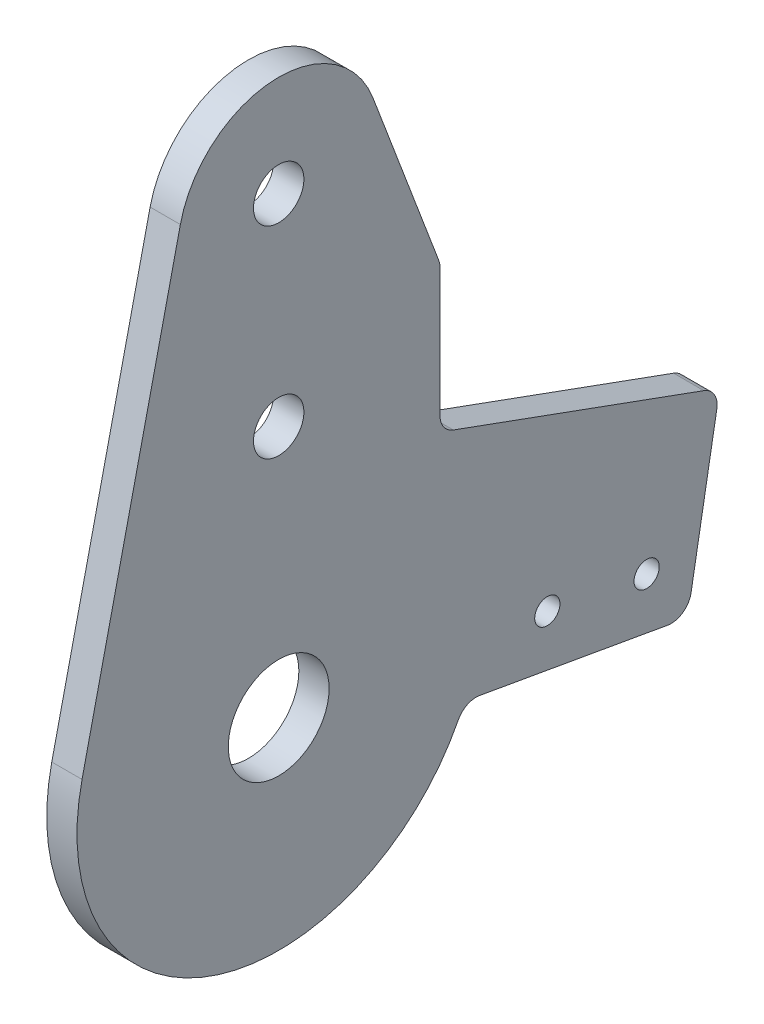
ISO-10303-21;
HEADER;
FILE_DESCRIPTION(('STEP AP214'),'2;1');
FILE_NAME('part.step','',(''),(''),'','','');
FILE_SCHEMA(('AUTOMOTIVE_DESIGN { 1 0 10303 214 1 1 1 1 }'));
ENDSEC;
DATA;
#1=APPLICATION_CONTEXT('core data for automotive mechanical design processes');
#2=APPLICATION_PROTOCOL_DEFINITION('international standard','automotive_design',2000,#1);
#3=PRODUCT_CONTEXT('',#1,'mechanical');
#4=PRODUCT('Part','Part','',(#3));
#5=PRODUCT_RELATED_PRODUCT_CATEGORY('part','',(#4));
#6=PRODUCT_DEFINITION_FORMATION('','',#4);
#7=PRODUCT_DEFINITION_CONTEXT('part definition',#1,'design');
#8=PRODUCT_DEFINITION('design','',#6,#7);
#9=PRODUCT_DEFINITION_SHAPE('','',#8);
#10=(LENGTH_UNIT() NAMED_UNIT(*) SI_UNIT(.MILLI.,.METRE.));
#11=(NAMED_UNIT(*) PLANE_ANGLE_UNIT() SI_UNIT($,.RADIAN.));
#12=(NAMED_UNIT(*) SI_UNIT($,.STERADIAN.) SOLID_ANGLE_UNIT());
#13=UNCERTAINTY_MEASURE_WITH_UNIT(LENGTH_MEASURE(1.E-05),#10,'distance_accuracy_value','');
#14=(GEOMETRIC_REPRESENTATION_CONTEXT(3) GLOBAL_UNCERTAINTY_ASSIGNED_CONTEXT((#13)) GLOBAL_UNIT_ASSIGNED_CONTEXT((#10,
#11,#12)) REPRESENTATION_CONTEXT('',''));
#15=CARTESIAN_POINT('',(0.,0.,0.));
#16=DIRECTION('',(0.,0.,1.));
#17=DIRECTION('',(1.,0.,0.));
#18=AXIS2_PLACEMENT_3D('',#15,#16,#17);
#19=CARTESIAN_POINT('',(3.,15.,50.));
#20=DIRECTION('',(1.,0.,0.));
#21=DIRECTION('',(0.,0.,-1.));
#22=AXIS2_PLACEMENT_3D('',#19,#20,#21);
#23=PLANE('',#22);
#24=CARTESIAN_POINT('',(3.,-34.1684893345555,23.3612051660587));
#25=DIRECTION('',(1.,0.,0.));
#26=DIRECTION('',(0.,0.,-1.));
#27=AXIS2_PLACEMENT_3D('',#24,#25,#26);
#28=CIRCLE('',#27,1.25);
#29=CARTESIAN_POINT('',(3.,-34.1684893345555,22.1112051660587));
#30=VERTEX_POINT('',#29);
#31=EDGE_CURVE('E543',#30,#30,#28,.T.);
#32=ORIENTED_EDGE('',*,*,#31,.F.);
#33=EDGE_LOOP('',(#32));
#34=FACE_BOUND('',#33,.T.);
#35=CARTESIAN_POINT('',(3.,-30.,50.));
#36=DIRECTION('',(1.,0.,0.));
#37=DIRECTION('',(0.,0.,-1.));
#38=AXIS2_PLACEMENT_3D('',#35,#36,#37);
#39=CIRCLE('',#38,5.);
#40=CARTESIAN_POINT('',(3.,-30.,45.));
#41=VERTEX_POINT('',#40);
#42=EDGE_CURVE('E568',#41,#41,#39,.T.);
#43=ORIENTED_EDGE('',*,*,#42,.F.);
#44=EDGE_LOOP('',(#43));
#45=FACE_BOUND('',#44,.T.);
#46=DIRECTION('',(0.,0.984807753012208,-0.173648177666931));
#47=VECTOR('',#46,1.);
#48=CARTESIAN_POINT('',(3.,-41.6972507646205,9.45732975921019));
#49=LINE('',#48,#47);
#50=CARTESIAN_POINT('',(3.,-39.7276352585961,9.11003340387632));
#51=VERTEX_POINT('',#50);
#52=CARTESIAN_POINT('',(3.,-25.2245440688507,6.55274712344899));
#53=VERTEX_POINT('',#52);
#54=EDGE_CURVE('E262',#51,#53,#49,.T.);
#55=ORIENTED_EDGE('',*,*,#54,.T.);
#56=CARTESIAN_POINT('',(3.,-24.8772477135169,8.52236262947341));
#57=DIRECTION('',(1.,0.,0.));
#58=DIRECTION('',(0.,0.,-1.));
#59=AXIS2_PLACEMENT_3D('',#56,#57,#58);
#60=CIRCLE('',#59,2.);
#61=CARTESIAN_POINT('',(3.,-22.9978624719451,7.83832234282207));
#62=VERTEX_POINT('',#61);
#63=EDGE_CURVE('E214',#53,#62,#60,.T.);
#64=ORIENTED_EDGE('',*,*,#63,.T.);
#65=DIRECTION('',(0.,0.34202014332567,0.939692620785908));
#66=VECTOR('',#65,1.);
#67=CARTESIAN_POINT('',(3.,-13.4757905262651,34.));
#68=LINE('',#67,#66);
#69=CARTESIAN_POINT('',(3.,-13.9547606914175,32.6840402866513));
#70=VERTEX_POINT('',#69);
#71=EDGE_CURVE('E255',#62,#70,#68,.T.);
#72=ORIENTED_EDGE('',*,*,#71,.T.);
#73=CARTESIAN_POINT('',(3.,-12.0753754498457,32.));
#74=DIRECTION('',(1.,0.,0.));
#75=DIRECTION('',(0.,0.,-1.));
#76=AXIS2_PLACEMENT_3D('',#73,#74,#75);
#77=CIRCLE('',#76,2.);
#78=CARTESIAN_POINT('',(3.,-12.0753754498457,34.));
#79=VERTEX_POINT('',#78);
#80=EDGE_CURVE('E11',#70,#79,#77,.F.);
#81=ORIENTED_EDGE('',*,*,#80,.T.);
#82=DIRECTION('',(0.,1.,0.));
#83=VECTOR('',#82,1.);
#84=CARTESIAN_POINT('',(3.,-13.4757905262651,34.));
#85=LINE('',#84,#83);
#86=CARTESIAN_POINT('',(3.,0.633718227746634,34.));
#87=VERTEX_POINT('',#86);
#88=EDGE_CURVE('E254',#79,#87,#85,.T.);
#89=ORIENTED_EDGE('',*,*,#88,.T.);
#90=CARTESIAN_POINT('',(3.,0.633718227746634,36.));
#91=DIRECTION('',(1.,0.,0.));
#92=DIRECTION('',(0.,0.,-1.));
#93=AXIS2_PLACEMENT_3D('',#90,#91,#92);
#94=CIRCLE('',#93,2.);
#95=CARTESIAN_POINT('',(3.,1.34250853141345,34.1298084842915));
#96=VERTEX_POINT('',#95);
#97=EDGE_CURVE('E61',#87,#96,#94,.T.);
#98=ORIENTED_EDGE('',*,*,#97,.T.);
#99=DIRECTION('',(0.,0.93509575785423,0.354395151833406));
#100=VECTOR('',#99,1.);
#101=CARTESIAN_POINT('',(3.,0.999999999999997,34.));
#102=LINE('',#101,#100);
#103=CARTESIAN_POINT('',(3.,18.5439515183341,40.6490424214577));
#104=VERTEX_POINT('',#103);
#105=EDGE_CURVE('E159',#96,#104,#102,.T.);
#106=ORIENTED_EDGE('',*,*,#105,.T.);
#107=CARTESIAN_POINT('',(3.,15.,50.));
#108=DIRECTION('',(1.,0.,0.));
#109=DIRECTION('',(0.,0.,-1.));
#110=AXIS2_PLACEMENT_3D('',#107,#108,#109);
#111=CIRCLE('',#110,10.);
#112=CARTESIAN_POINT('',(3.,17.2222222222222,59.7499604304357));
#113=VERTEX_POINT('',#112);
#114=EDGE_CURVE('E154',#104,#113,#111,.T.);
#115=ORIENTED_EDGE('',*,*,#114,.T.);
#116=DIRECTION('',(0.,-0.974996043043569,0.222222222222222));
#117=VECTOR('',#116,1.);
#118=CARTESIAN_POINT('',(3.,17.2222222222222,59.7499604304357));
#119=LINE('',#118,#117);
#120=CARTESIAN_POINT('',(3.,-25.5555555555556,69.4999208608714));
#121=VERTEX_POINT('',#120);
#122=EDGE_CURVE('E142',#113,#121,#119,.T.);
#123=ORIENTED_EDGE('',*,*,#122,.T.);
#124=CARTESIAN_POINT('',(3.,-30.,50.));
#125=DIRECTION('',(1.,0.,0.));
#126=DIRECTION('',(0.,0.,-1.));
#127=AXIS2_PLACEMENT_3D('',#124,#125,#126);
#128=CIRCLE('',#127,20.);
#129=CARTESIAN_POINT('',(3.,-39.1197842054181,32.200293933702));
#130=VERTEX_POINT('',#129);
#131=EDGE_CURVE('E153',#121,#130,#128,.T.);
#132=ORIENTED_EDGE('',*,*,#131,.T.);
#133=CARTESIAN_POINT('',(3.,-40.0317626259599,30.4203233270722));
#134=DIRECTION('',(1.,0.,0.));
#135=DIRECTION('',(0.,0.,-1.));
#136=AXIS2_PLACEMENT_3D('',#133,#134,#135);
#137=CIRCLE('',#136,2.);
#138=CARTESIAN_POINT('',(3.,-38.0621471199355,30.0730269717383));
#139=VERTEX_POINT('',#138);
#140=EDGE_CURVE('E230',#130,#139,#137,.F.);
#141=ORIENTED_EDGE('',*,*,#140,.T.);
#142=DIRECTION('',(0.,-0.17364817766693,-0.984807753012208));
#143=VECTOR('',#142,1.);
#144=CARTESIAN_POINT('',(3.,-41.6972507646205,9.45732975921019));
#145=LINE('',#144,#143);
#146=CARTESIAN_POINT('',(3.,-41.3499544092866,11.4269452652346));
#147=VERTEX_POINT('',#146);
#148=EDGE_CURVE('E295',#139,#147,#145,.T.);
#149=ORIENTED_EDGE('',*,*,#148,.T.);
#150=CARTESIAN_POINT('',(3.,-39.3803389032622,11.0796489099007));
#151=DIRECTION('',(1.,0.,0.));
#152=DIRECTION('',(0.,0.,-1.));
#153=AXIS2_PLACEMENT_3D('',#150,#151,#152);
#154=CIRCLE('',#153,2.);
#155=EDGE_CURVE('E209',#147,#51,#154,.T.);
#156=ORIENTED_EDGE('',*,*,#155,.T.);
#157=EDGE_LOOP('',(#55,#64,#72,#81,#89,#98,#106,#115,#123,#132,#141,#149,#156));
#158=FACE_BOUND('',#157,.T.);
#159=CARTESIAN_POINT('',(3.,-5.,50.));
#160=DIRECTION('',(1.,0.,0.));
#161=DIRECTION('',(0.,0.,-1.));
#162=AXIS2_PLACEMENT_3D('',#159,#160,#161);
#163=CIRCLE('',#162,2.5);
#164=CARTESIAN_POINT('',(3.,-5.,47.5));
#165=VERTEX_POINT('',#164);
#166=EDGE_CURVE('E269',#165,#165,#163,.T.);
#167=ORIENTED_EDGE('',*,*,#166,.F.);
#168=EDGE_LOOP('',(#167));
#169=FACE_BOUND('',#168,.T.);
#170=CARTESIAN_POINT('',(3.,15.,50.));
#171=DIRECTION('',(1.,0.,0.));
#172=DIRECTION('',(0.,0.,-1.));
#173=AXIS2_PLACEMENT_3D('',#170,#171,#172);
#174=CIRCLE('',#173,2.5);
#175=CARTESIAN_POINT('',(3.,15.,47.5));
#176=VERTEX_POINT('',#175);
#177=EDGE_CURVE('E560',#176,#176,#174,.T.);
#178=ORIENTED_EDGE('',*,*,#177,.F.);
#179=EDGE_LOOP('',(#178));
#180=FACE_BOUND('',#179,.T.);
#181=CARTESIAN_POINT('',(3.,-35.9049711112248,13.5131276359366));
#182=DIRECTION('',(1.,0.,0.));
#183=DIRECTION('',(0.,0.,-1.));
#184=AXIS2_PLACEMENT_3D('',#181,#182,#183);
#185=CIRCLE('',#184,1.25);
#186=CARTESIAN_POINT('',(3.,-35.9049711112248,12.2631276359366));
#187=VERTEX_POINT('',#186);
#188=EDGE_CURVE('E549',#187,#187,#185,.T.);
#189=ORIENTED_EDGE('',*,*,#188,.F.);
#190=EDGE_LOOP('',(#189));
#191=FACE_BOUND('',#190,.T.);
#192=ADVANCED_FACE('F45',(#34,#45,#158,#169,#180,#191),#23,.T.);
#193=CARTESIAN_POINT('',(0.,15.,50.));
#194=DIRECTION('',(1.,0.,0.));
#195=DIRECTION('',(0.,0.,-1.));
#196=AXIS2_PLACEMENT_3D('',#193,#194,#195);
#197=PLANE('',#196);
#198=DIRECTION('',(0.,0.34202014332567,0.939692620785908));
#199=VECTOR('',#198,1.);
#200=CARTESIAN_POINT('',(0.,-13.4757905262651,34.));
#201=LINE('',#200,#199);
#202=CARTESIAN_POINT('',(0.,-22.9978624719451,7.83832234282207));
#203=VERTEX_POINT('',#202);
#204=CARTESIAN_POINT('',(0.,-13.9547606914175,32.6840402866513));
#205=VERTEX_POINT('',#204);
#206=EDGE_CURVE('E239',#203,#205,#201,.T.);
#207=ORIENTED_EDGE('',*,*,#206,.F.);
#208=CARTESIAN_POINT('',(0.,-24.8772477135169,8.52236262947341));
#209=DIRECTION('',(1.,0.,0.));
#210=DIRECTION('',(0.,0.,-1.));
#211=AXIS2_PLACEMENT_3D('',#208,#209,#210);
#212=CIRCLE('',#211,2.);
#213=CARTESIAN_POINT('',(0.,-25.2245440688507,6.55274712344899));
#214=VERTEX_POINT('',#213);
#215=EDGE_CURVE('E199',#203,#214,#212,.F.);
#216=ORIENTED_EDGE('',*,*,#215,.T.);
#217=DIRECTION('',(0.,0.984807753012208,-0.173648177666931));
#218=VECTOR('',#217,1.);
#219=CARTESIAN_POINT('',(0.,-41.6972507646205,9.45732975921019));
#220=LINE('',#219,#218);
#221=CARTESIAN_POINT('',(0.,-39.7276352585961,9.11003340387632));
#222=VERTEX_POINT('',#221);
#223=EDGE_CURVE('E250',#222,#214,#220,.T.);
#224=ORIENTED_EDGE('',*,*,#223,.F.);
#225=CARTESIAN_POINT('',(0.,-39.3803389032622,11.0796489099007));
#226=DIRECTION('',(1.,0.,0.));
#227=DIRECTION('',(0.,0.,-1.));
#228=AXIS2_PLACEMENT_3D('',#225,#226,#227);
#229=CIRCLE('',#228,2.);
#230=CARTESIAN_POINT('',(0.,-41.3499544092866,11.4269452652346));
#231=VERTEX_POINT('',#230);
#232=EDGE_CURVE('E193',#222,#231,#229,.F.);
#233=ORIENTED_EDGE('',*,*,#232,.T.);
#234=DIRECTION('',(0.,-0.17364817766693,-0.984807753012208));
#235=VECTOR('',#234,1.);
#236=CARTESIAN_POINT('',(0.,-41.6972507646205,9.45732975921019));
#237=LINE('',#236,#235);
#238=CARTESIAN_POINT('',(0.,-38.0621471199355,30.0730269717383));
#239=VERTEX_POINT('',#238);
#240=EDGE_CURVE('E276',#239,#231,#237,.T.);
#241=ORIENTED_EDGE('',*,*,#240,.F.);
#242=CARTESIAN_POINT('',(0.,-40.0317626259599,30.4203233270722));
#243=DIRECTION('',(1.,0.,0.));
#244=DIRECTION('',(0.,0.,-1.));
#245=AXIS2_PLACEMENT_3D('',#242,#243,#244);
#246=CIRCLE('',#245,2.);
#247=CARTESIAN_POINT('',(0.,-39.1197842054181,32.200293933702));
#248=VERTEX_POINT('',#247);
#249=EDGE_CURVE('E227',#239,#248,#246,.T.);
#250=ORIENTED_EDGE('',*,*,#249,.T.);
#251=CARTESIAN_POINT('',(0.,-30.,50.));
#252=DIRECTION('',(1.,0.,0.));
#253=DIRECTION('',(0.,0.,-1.));
#254=AXIS2_PLACEMENT_3D('',#251,#252,#253);
#255=CIRCLE('',#254,20.);
#256=CARTESIAN_POINT('',(0.,-25.5555555555556,69.4999208608714));
#257=VERTEX_POINT('',#256);
#258=EDGE_CURVE('E272',#257,#248,#255,.T.);
#259=ORIENTED_EDGE('',*,*,#258,.F.);
#260=DIRECTION('',(0.,-0.974996043043569,0.222222222222222));
#261=VECTOR('',#260,1.);
#262=CARTESIAN_POINT('',(0.,17.2222222222222,59.7499604304357));
#263=LINE('',#262,#261);
#264=CARTESIAN_POINT('',(0.,17.2222222222222,59.7499604304357));
#265=VERTEX_POINT('',#264);
#266=EDGE_CURVE('E268',#265,#257,#263,.T.);
#267=ORIENTED_EDGE('',*,*,#266,.F.);
#268=CARTESIAN_POINT('',(0.,15.,50.));
#269=DIRECTION('',(1.,0.,0.));
#270=DIRECTION('',(0.,0.,-1.));
#271=AXIS2_PLACEMENT_3D('',#268,#269,#270);
#272=CIRCLE('',#271,10.);
#273=CARTESIAN_POINT('',(0.,18.5439515183341,40.6490424214577));
#274=VERTEX_POINT('',#273);
#275=EDGE_CURVE('E168',#274,#265,#272,.T.);
#276=ORIENTED_EDGE('',*,*,#275,.F.);
#277=DIRECTION('',(0.,0.93509575785423,0.354395151833406));
#278=VECTOR('',#277,1.);
#279=CARTESIAN_POINT('',(0.,0.999999999999997,34.));
#280=LINE('',#279,#278);
#281=CARTESIAN_POINT('',(0.,1.34250853141345,34.1298084842915));
#282=VERTEX_POINT('',#281);
#283=EDGE_CURVE('E164',#282,#274,#280,.T.);
#284=ORIENTED_EDGE('',*,*,#283,.F.);
#285=CARTESIAN_POINT('',(0.,0.633718227746634,36.));
#286=DIRECTION('',(1.,0.,0.));
#287=DIRECTION('',(0.,0.,-1.));
#288=AXIS2_PLACEMENT_3D('',#285,#286,#287);
#289=CIRCLE('',#288,2.);
#290=CARTESIAN_POINT('',(0.,0.633718227746634,34.));
#291=VERTEX_POINT('',#290);
#292=EDGE_CURVE('E196',#282,#291,#289,.F.);
#293=ORIENTED_EDGE('',*,*,#292,.T.);
#294=DIRECTION('',(0.,1.,0.));
#295=VECTOR('',#294,1.);
#296=CARTESIAN_POINT('',(0.,-13.4757905262651,34.));
#297=LINE('',#296,#295);
#298=CARTESIAN_POINT('',(0.,-12.0753754498457,34.));
#299=VERTEX_POINT('',#298);
#300=EDGE_CURVE('E240',#299,#291,#297,.T.);
#301=ORIENTED_EDGE('',*,*,#300,.F.);
#302=CARTESIAN_POINT('',(0.,-12.0753754498457,32.));
#303=DIRECTION('',(1.,0.,0.));
#304=DIRECTION('',(0.,0.,-1.));
#305=AXIS2_PLACEMENT_3D('',#302,#303,#304);
#306=CIRCLE('',#305,2.);
#307=EDGE_CURVE('E54',#299,#205,#306,.T.);
#308=ORIENTED_EDGE('',*,*,#307,.T.);
#309=EDGE_LOOP('',(#207,#216,#224,#233,#241,#250,#259,#267,#276,#284,#293,#301,#308));
#310=FACE_BOUND('',#309,.T.);
#311=CARTESIAN_POINT('',(0.,-5.,50.));
#312=DIRECTION('',(1.,0.,0.));
#313=DIRECTION('',(0.,0.,-1.));
#314=AXIS2_PLACEMENT_3D('',#311,#312,#313);
#315=CIRCLE('',#314,2.5);
#316=CARTESIAN_POINT('',(0.,-5.,47.5));
#317=VERTEX_POINT('',#316);
#318=EDGE_CURVE('E572',#317,#317,#315,.T.);
#319=ORIENTED_EDGE('',*,*,#318,.T.);
#320=EDGE_LOOP('',(#319));
#321=FACE_BOUND('',#320,.T.);
#322=CARTESIAN_POINT('',(0.,-30.,50.));
#323=DIRECTION('',(1.,0.,0.));
#324=DIRECTION('',(0.,0.,-1.));
#325=AXIS2_PLACEMENT_3D('',#322,#323,#324);
#326=CIRCLE('',#325,5.);
#327=CARTESIAN_POINT('',(0.,-30.,45.));
#328=VERTEX_POINT('',#327);
#329=EDGE_CURVE('E564',#328,#328,#326,.T.);
#330=ORIENTED_EDGE('',*,*,#329,.T.);
#331=EDGE_LOOP('',(#330));
#332=FACE_BOUND('',#331,.T.);
#333=CARTESIAN_POINT('',(0.,15.,50.));
#334=DIRECTION('',(1.,0.,0.));
#335=DIRECTION('',(0.,0.,-1.));
#336=AXIS2_PLACEMENT_3D('',#333,#334,#335);
#337=CIRCLE('',#336,2.5);
#338=CARTESIAN_POINT('',(0.,15.,47.5));
#339=VERTEX_POINT('',#338);
#340=EDGE_CURVE('E553',#339,#339,#337,.T.);
#341=ORIENTED_EDGE('',*,*,#340,.T.);
#342=EDGE_LOOP('',(#341));
#343=FACE_BOUND('',#342,.T.);
#344=CARTESIAN_POINT('',(0.,-34.1684893345555,23.3612051660587));
#345=DIRECTION('',(1.,0.,0.));
#346=DIRECTION('',(0.,0.,-1.));
#347=AXIS2_PLACEMENT_3D('',#344,#345,#346);
#348=CIRCLE('',#347,1.25);
#349=CARTESIAN_POINT('',(0.,-34.1684893345555,22.1112051660587));
#350=VERTEX_POINT('',#349);
#351=EDGE_CURVE('E546',#350,#350,#348,.T.);
#352=ORIENTED_EDGE('',*,*,#351,.T.);
#353=EDGE_LOOP('',(#352));
#354=FACE_BOUND('',#353,.T.);
#355=CARTESIAN_POINT('',(0.,-35.9049711112248,13.5131276359366));
#356=DIRECTION('',(1.,0.,0.));
#357=DIRECTION('',(0.,0.,-1.));
#358=AXIS2_PLACEMENT_3D('',#355,#356,#357);
#359=CIRCLE('',#358,1.25);
#360=CARTESIAN_POINT('',(0.,-35.9049711112248,12.2631276359366));
#361=VERTEX_POINT('',#360);
#362=EDGE_CURVE('E556',#361,#361,#359,.T.);
#363=ORIENTED_EDGE('',*,*,#362,.T.);
#364=EDGE_LOOP('',(#363));
#365=FACE_BOUND('',#364,.T.);
#366=ADVANCED_FACE('F237',(#310,#321,#332,#343,#354,#365),#197,.F.);
#367=CARTESIAN_POINT('',(3.,15.,50.));
#368=DIRECTION('',(-1.,0.,0.));
#369=DIRECTION('',(0.,0.,1.));
#370=AXIS2_PLACEMENT_3D('',#367,#368,#369);
#371=CYLINDRICAL_SURFACE('',#370,10.);
#372=ORIENTED_EDGE('',*,*,#275,.T.);
#373=DIRECTION('',(-1.,0.,0.));
#374=VECTOR('',#373,1.);
#375=CARTESIAN_POINT('',(3.,17.2222222222222,59.7499604304357));
#376=LINE('',#375,#374);
#377=EDGE_CURVE('E146',#113,#265,#376,.T.);
#378=ORIENTED_EDGE('',*,*,#377,.F.);
#379=ORIENTED_EDGE('',*,*,#114,.F.);
#380=DIRECTION('',(-1.,0.,0.));
#381=VECTOR('',#380,1.);
#382=CARTESIAN_POINT('',(3.,18.5439515183341,40.6490424214577));
#383=LINE('',#382,#381);
#384=EDGE_CURVE('E176',#104,#274,#383,.T.);
#385=ORIENTED_EDGE('',*,*,#384,.T.);
#386=EDGE_LOOP('',(#372,#378,#379,#385));
#387=FACE_BOUND('',#386,.T.);
#388=ADVANCED_FACE('F166',(#387),#371,.T.);
#389=CARTESIAN_POINT('',(3.,17.2222222222222,59.7499604304357));
#390=DIRECTION('',(0.,-0.222222222222222,-0.974996043043569));
#391=DIRECTION('',(0.,0.974996043043569,-0.222222222222222));
#392=AXIS2_PLACEMENT_3D('',#389,#390,#391);
#393=PLANE('',#392);
#394=ORIENTED_EDGE('',*,*,#266,.T.);
#395=DIRECTION('',(-1.,0.,0.));
#396=VECTOR('',#395,1.);
#397=CARTESIAN_POINT('',(3.,-25.5555555555556,69.4999208608714));
#398=LINE('',#397,#396);
#399=EDGE_CURVE('E149',#121,#257,#398,.T.);
#400=ORIENTED_EDGE('',*,*,#399,.F.);
#401=ORIENTED_EDGE('',*,*,#122,.F.);
#402=ORIENTED_EDGE('',*,*,#377,.T.);
#403=EDGE_LOOP('',(#394,#400,#401,#402));
#404=FACE_BOUND('',#403,.T.);
#405=ADVANCED_FACE('F144',(#404),#393,.F.);
#406=CARTESIAN_POINT('',(3.,-30.,50.));
#407=DIRECTION('',(-1.,0.,0.));
#408=DIRECTION('',(0.,0.,1.));
#409=AXIS2_PLACEMENT_3D('',#406,#407,#408);
#410=CYLINDRICAL_SURFACE('',#409,20.);
#411=ORIENTED_EDGE('',*,*,#258,.T.);
#412=DIRECTION('',(-1.,0.,0.));
#413=VECTOR('',#412,1.);
#414=CARTESIAN_POINT('',(3.,-39.1197842054181,32.200293933702));
#415=LINE('',#414,#413);
#416=EDGE_CURVE('E183',#248,#130,#415,.F.);
#417=ORIENTED_EDGE('',*,*,#416,.T.);
#418=ORIENTED_EDGE('',*,*,#131,.F.);
#419=ORIENTED_EDGE('',*,*,#399,.T.);
#420=EDGE_LOOP('',(#411,#417,#418,#419));
#421=FACE_BOUND('',#420,.T.);
#422=ADVANCED_FACE('F291',(#421),#410,.T.);
#423=CARTESIAN_POINT('',(3.,-41.6972507646205,9.45732975921019));
#424=DIRECTION('',(0.,0.984807753012208,-0.17364817766693));
#425=DIRECTION('',(0.,0.17364817766693,0.984807753012208));
#426=AXIS2_PLACEMENT_3D('',#423,#424,#425);
#427=PLANE('',#426);
#428=ORIENTED_EDGE('',*,*,#148,.F.);
#429=DIRECTION('',(1.,0.,0.));
#430=VECTOR('',#429,1.);
#431=CARTESIAN_POINT('',(0.,-38.0621471199355,30.0730269717383));
#432=LINE('',#431,#430);
#433=EDGE_CURVE('E174',#139,#239,#432,.F.);
#434=ORIENTED_EDGE('',*,*,#433,.T.);
#435=ORIENTED_EDGE('',*,*,#240,.T.);
#436=DIRECTION('',(-1.,0.,0.));
#437=VECTOR('',#436,1.);
#438=CARTESIAN_POINT('',(3.,-41.3499544092866,11.4269452652346));
#439=LINE('',#438,#437);
#440=EDGE_CURVE('E170',#231,#147,#439,.F.);
#441=ORIENTED_EDGE('',*,*,#440,.T.);
#442=EDGE_LOOP('',(#428,#434,#435,#441));
#443=FACE_BOUND('',#442,.T.);
#444=ADVANCED_FACE('F316',(#443),#427,.F.);
#445=CARTESIAN_POINT('',(3.,-41.6972507646205,9.45732975921019));
#446=DIRECTION('',(0.,0.173648177666931,0.984807753012208));
#447=DIRECTION('',(0.,-0.984807753012208,0.173648177666931));
#448=AXIS2_PLACEMENT_3D('',#445,#446,#447);
#449=PLANE('',#448);
#450=ORIENTED_EDGE('',*,*,#223,.T.);
#451=DIRECTION('',(-1.,0.,0.));
#452=VECTOR('',#451,1.);
#453=CARTESIAN_POINT('',(3.,-25.2245440688507,6.55274712344899));
#454=LINE('',#453,#452);
#455=EDGE_CURVE('E206',#214,#53,#454,.F.);
#456=ORIENTED_EDGE('',*,*,#455,.T.);
#457=ORIENTED_EDGE('',*,*,#54,.F.);
#458=DIRECTION('',(-1.,0.,0.));
#459=VECTOR('',#458,1.);
#460=CARTESIAN_POINT('',(3.,-39.7276352585961,9.11003340387632));
#461=LINE('',#460,#459);
#462=EDGE_CURVE('E202',#51,#222,#461,.T.);
#463=ORIENTED_EDGE('',*,*,#462,.T.);
#464=EDGE_LOOP('',(#450,#456,#457,#463));
#465=FACE_BOUND('',#464,.T.);
#466=ADVANCED_FACE('F310',(#465),#449,.F.);
#467=CARTESIAN_POINT('',(3.,-13.4757905262651,34.));
#468=DIRECTION('',(0.,-0.939692620785908,0.34202014332567));
#469=DIRECTION('',(0.,-0.34202014332567,-0.939692620785908));
#470=AXIS2_PLACEMENT_3D('',#467,#468,#469);
#471=PLANE('',#470);
#472=ORIENTED_EDGE('',*,*,#71,.F.);
#473=DIRECTION('',(-1.,0.,0.));
#474=VECTOR('',#473,1.);
#475=CARTESIAN_POINT('',(3.,-22.9978624719451,7.83832234282207));
#476=LINE('',#475,#474);
#477=EDGE_CURVE('E189',#62,#203,#476,.T.);
#478=ORIENTED_EDGE('',*,*,#477,.T.);
#479=ORIENTED_EDGE('',*,*,#206,.T.);
#480=DIRECTION('',(-1.,0.,0.));
#481=VECTOR('',#480,1.);
#482=CARTESIAN_POINT('',(3.,-13.9547606914175,32.6840402866513));
#483=LINE('',#482,#481);
#484=EDGE_CURVE('E186',#205,#70,#483,.F.);
#485=ORIENTED_EDGE('',*,*,#484,.T.);
#486=EDGE_LOOP('',(#472,#478,#479,#485));
#487=FACE_BOUND('',#486,.T.);
#488=ADVANCED_FACE('F246',(#487),#471,.F.);
#489=CARTESIAN_POINT('',(3.,-13.4757905262651,34.));
#490=DIRECTION('',(0.,0.,1.));
#491=DIRECTION('',(1.,0.,0.));
#492=AXIS2_PLACEMENT_3D('',#489,#490,#491);
#493=PLANE('',#492);
#494=ORIENTED_EDGE('',*,*,#88,.F.);
#495=DIRECTION('',(-1.,0.,0.));
#496=VECTOR('',#495,1.);
#497=CARTESIAN_POINT('',(0.,-12.0753754498457,34.));
#498=LINE('',#497,#496);
#499=EDGE_CURVE('E219',#79,#299,#498,.T.);
#500=ORIENTED_EDGE('',*,*,#499,.T.);
#501=ORIENTED_EDGE('',*,*,#300,.T.);
#502=DIRECTION('',(-1.,0.,0.));
#503=VECTOR('',#502,1.);
#504=CARTESIAN_POINT('',(3.,0.633718227746634,34.));
#505=LINE('',#504,#503);
#506=EDGE_CURVE('E69',#291,#87,#505,.F.);
#507=ORIENTED_EDGE('',*,*,#506,.T.);
#508=EDGE_LOOP('',(#494,#500,#501,#507));
#509=FACE_BOUND('',#508,.T.);
#510=ADVANCED_FACE('F256',(#509),#493,.F.);
#511=CARTESIAN_POINT('',(3.,0.999999999999997,34.));
#512=DIRECTION('',(0.,-0.354395151833406,0.93509575785423));
#513=DIRECTION('',(0.,-0.93509575785423,-0.354395151833406));
#514=AXIS2_PLACEMENT_3D('',#511,#512,#513);
#515=PLANE('',#514);
#516=ORIENTED_EDGE('',*,*,#105,.F.);
#517=DIRECTION('',(-1.,0.,0.));
#518=VECTOR('',#517,1.);
#519=CARTESIAN_POINT('',(3.,1.34250853141345,34.1298084842915));
#520=LINE('',#519,#518);
#521=EDGE_CURVE('E223',#96,#282,#520,.T.);
#522=ORIENTED_EDGE('',*,*,#521,.T.);
#523=ORIENTED_EDGE('',*,*,#283,.T.);
#524=ORIENTED_EDGE('',*,*,#384,.F.);
#525=EDGE_LOOP('',(#516,#522,#523,#524));
#526=FACE_BOUND('',#525,.T.);
#527=ADVANCED_FACE('F345',(#526),#515,.F.);
#528=CARTESIAN_POINT('',(3.,-5.,50.));
#529=DIRECTION('',(-1.,0.,0.));
#530=DIRECTION('',(0.,0.,1.));
#531=AXIS2_PLACEMENT_3D('',#528,#529,#530);
#532=CYLINDRICAL_SURFACE('',#531,2.5);
#533=ORIENTED_EDGE('',*,*,#166,.T.);
#534=EDGE_LOOP('',(#533));
#535=FACE_BOUND('',#534,.T.);
#536=ORIENTED_EDGE('',*,*,#318,.F.);
#537=EDGE_LOOP('',(#536));
#538=FACE_BOUND('',#537,.T.);
#539=ADVANCED_FACE('F342',(#535,#538),#532,.F.);
#540=CARTESIAN_POINT('',(3.,-30.,50.));
#541=DIRECTION('',(-1.,0.,0.));
#542=DIRECTION('',(0.,0.,1.));
#543=AXIS2_PLACEMENT_3D('',#540,#541,#542);
#544=CYLINDRICAL_SURFACE('',#543,5.);
#545=ORIENTED_EDGE('',*,*,#42,.T.);
#546=EDGE_LOOP('',(#545));
#547=FACE_BOUND('',#546,.T.);
#548=ORIENTED_EDGE('',*,*,#329,.F.);
#549=EDGE_LOOP('',(#548));
#550=FACE_BOUND('',#549,.T.);
#551=ADVANCED_FACE('F398',(#547,#550),#544,.F.);
#552=CARTESIAN_POINT('',(3.,15.,50.));
#553=DIRECTION('',(-1.,0.,0.));
#554=DIRECTION('',(0.,0.,1.));
#555=AXIS2_PLACEMENT_3D('',#552,#553,#554);
#556=CYLINDRICAL_SURFACE('',#555,2.5);
#557=ORIENTED_EDGE('',*,*,#177,.T.);
#558=EDGE_LOOP('',(#557));
#559=FACE_BOUND('',#558,.T.);
#560=ORIENTED_EDGE('',*,*,#340,.F.);
#561=EDGE_LOOP('',(#560));
#562=FACE_BOUND('',#561,.T.);
#563=ADVANCED_FACE('F405',(#559,#562),#556,.F.);
#564=CARTESIAN_POINT('',(3.,-34.1684893345555,23.3612051660587));
#565=DIRECTION('',(-1.,0.,0.));
#566=DIRECTION('',(0.,0.,1.));
#567=AXIS2_PLACEMENT_3D('',#564,#565,#566);
#568=CYLINDRICAL_SURFACE('',#567,1.25);
#569=ORIENTED_EDGE('',*,*,#31,.T.);
#570=EDGE_LOOP('',(#569));
#571=FACE_BOUND('',#570,.T.);
#572=ORIENTED_EDGE('',*,*,#351,.F.);
#573=EDGE_LOOP('',(#572));
#574=FACE_BOUND('',#573,.T.);
#575=ADVANCED_FACE('F328',(#571,#574),#568,.F.);
#576=CARTESIAN_POINT('',(3.,-35.9049711112248,13.5131276359366));
#577=DIRECTION('',(-1.,0.,0.));
#578=DIRECTION('',(0.,0.,1.));
#579=AXIS2_PLACEMENT_3D('',#576,#577,#578);
#580=CYLINDRICAL_SURFACE('',#579,1.25);
#581=ORIENTED_EDGE('',*,*,#188,.T.);
#582=EDGE_LOOP('',(#581));
#583=FACE_BOUND('',#582,.T.);
#584=ORIENTED_EDGE('',*,*,#362,.F.);
#585=EDGE_LOOP('',(#584));
#586=FACE_BOUND('',#585,.T.);
#587=ADVANCED_FACE('F321',(#583,#586),#580,.F.);
#588=CARTESIAN_POINT('',(3.,-40.0317626259599,30.4203233270722));
#589=DIRECTION('',(-1.,0.,0.));
#590=DIRECTION('',(0.,0.,1.));
#591=AXIS2_PLACEMENT_3D('',#588,#589,#590);
#592=CYLINDRICAL_SURFACE('',#591,2.);
#593=ORIENTED_EDGE('',*,*,#140,.F.);
#594=ORIENTED_EDGE('',*,*,#416,.F.);
#595=ORIENTED_EDGE('',*,*,#249,.F.);
#596=ORIENTED_EDGE('',*,*,#433,.F.);
#597=EDGE_LOOP('',(#593,#594,#595,#596));
#598=FACE_BOUND('',#597,.T.);
#599=ADVANCED_FACE('F319',(#598),#592,.F.);
#600=CARTESIAN_POINT('',(3.,-24.8772477135169,8.52236262947341));
#601=DIRECTION('',(-1.,0.,0.));
#602=DIRECTION('',(0.,0.,1.));
#603=AXIS2_PLACEMENT_3D('',#600,#601,#602);
#604=CYLINDRICAL_SURFACE('',#603,2.);
#605=ORIENTED_EDGE('',*,*,#63,.F.);
#606=ORIENTED_EDGE('',*,*,#455,.F.);
#607=ORIENTED_EDGE('',*,*,#215,.F.);
#608=ORIENTED_EDGE('',*,*,#477,.F.);
#609=EDGE_LOOP('',(#605,#606,#607,#608));
#610=FACE_BOUND('',#609,.T.);
#611=ADVANCED_FACE('F308',(#610),#604,.T.);
#612=CARTESIAN_POINT('',(3.,-12.0753754498457,32.));
#613=DIRECTION('',(1.,0.,0.));
#614=DIRECTION('',(0.,0.,-1.));
#615=AXIS2_PLACEMENT_3D('',#612,#613,#614);
#616=CYLINDRICAL_SURFACE('',#615,2.);
#617=ORIENTED_EDGE('',*,*,#80,.F.);
#618=ORIENTED_EDGE('',*,*,#484,.F.);
#619=ORIENTED_EDGE('',*,*,#307,.F.);
#620=ORIENTED_EDGE('',*,*,#499,.F.);
#621=EDGE_LOOP('',(#617,#618,#619,#620));
#622=FACE_BOUND('',#621,.T.);
#623=ADVANCED_FACE('F253',(#622),#616,.F.);
#624=CARTESIAN_POINT('',(3.,0.633718227746634,36.));
#625=DIRECTION('',(-1.,0.,0.));
#626=DIRECTION('',(0.,0.,1.));
#627=AXIS2_PLACEMENT_3D('',#624,#625,#626);
#628=CYLINDRICAL_SURFACE('',#627,2.);
#629=ORIENTED_EDGE('',*,*,#97,.F.);
#630=ORIENTED_EDGE('',*,*,#506,.F.);
#631=ORIENTED_EDGE('',*,*,#292,.F.);
#632=ORIENTED_EDGE('',*,*,#521,.F.);
#633=EDGE_LOOP('',(#629,#630,#631,#632));
#634=FACE_BOUND('',#633,.T.);
#635=ADVANCED_FACE('F507',(#634),#628,.T.);
#636=CARTESIAN_POINT('',(3.,-39.3803389032622,11.0796489099007));
#637=DIRECTION('',(-1.,0.,0.));
#638=DIRECTION('',(0.,0.,1.));
#639=AXIS2_PLACEMENT_3D('',#636,#637,#638);
#640=CYLINDRICAL_SURFACE('',#639,2.);
#641=ORIENTED_EDGE('',*,*,#155,.F.);
#642=ORIENTED_EDGE('',*,*,#440,.F.);
#643=ORIENTED_EDGE('',*,*,#232,.F.);
#644=ORIENTED_EDGE('',*,*,#462,.F.);
#645=EDGE_LOOP('',(#641,#642,#643,#644));
#646=FACE_BOUND('',#645,.T.);
#647=ADVANCED_FACE('F47',(#646),#640,.T.);
#648=CLOSED_SHELL('',(#192,#366,#388,#405,#422,#444,#466,#488,#510,#527,#539,#551,#563,#575,
#587,#599,#611,#623,#635,#647));
#649=MANIFOLD_SOLID_BREP('B2',#648);
#650=ADVANCED_BREP_SHAPE_REPRESENTATION('',(#18,#649),#14);
#651=SHAPE_DEFINITION_REPRESENTATION(#9,#650);
ENDSEC;
END-ISO-10303-21;
